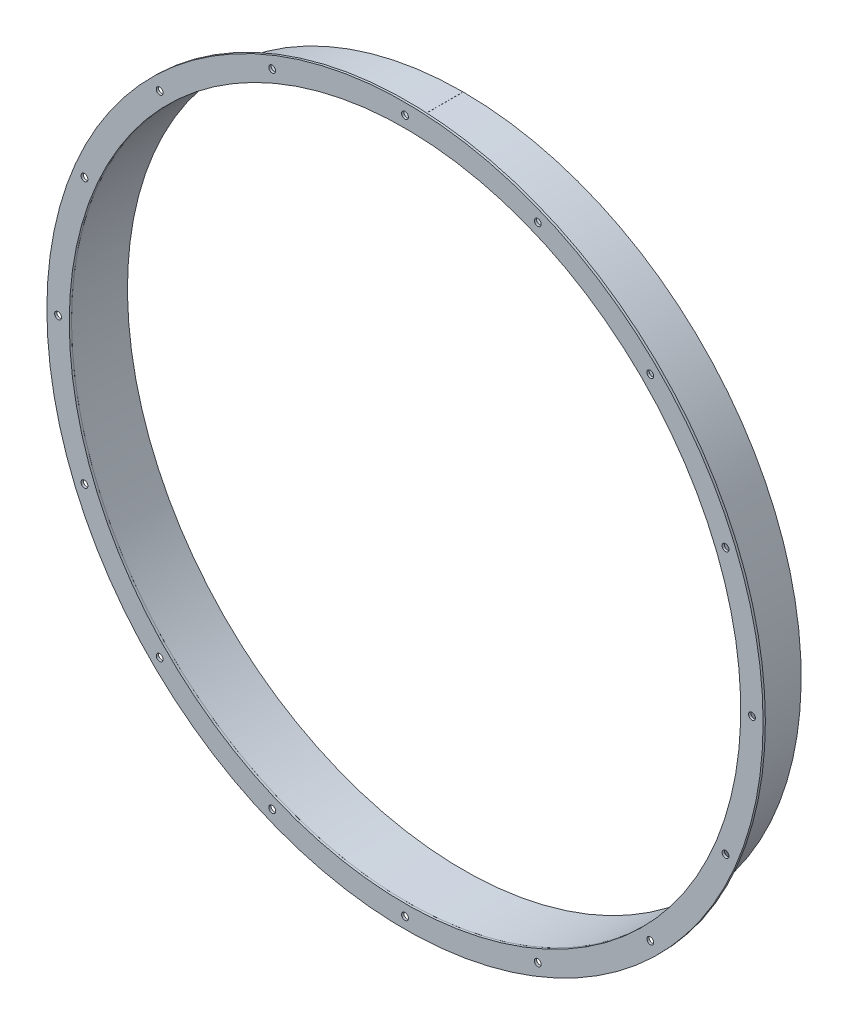
ISO-10303-21;
HEADER;
FILE_DESCRIPTION(('STEP AP214'),'2;1');
FILE_NAME('part.step','',(''),(''),'','','');
FILE_SCHEMA(('AUTOMOTIVE_DESIGN { 1 0 10303 214 1 1 1 1 }'));
ENDSEC;
DATA;
#1=APPLICATION_CONTEXT('core data for automotive mechanical design processes');
#2=APPLICATION_PROTOCOL_DEFINITION('international standard','automotive_design',2000,#1);
#3=PRODUCT_CONTEXT('',#1,'mechanical');
#4=PRODUCT('Part','Part','',(#3));
#5=PRODUCT_RELATED_PRODUCT_CATEGORY('part','',(#4));
#6=PRODUCT_DEFINITION_FORMATION('','',#4);
#7=PRODUCT_DEFINITION_CONTEXT('part definition',#1,'design');
#8=PRODUCT_DEFINITION('design','',#6,#7);
#9=PRODUCT_DEFINITION_SHAPE('','',#8);
#10=(LENGTH_UNIT() NAMED_UNIT(*) SI_UNIT(.MILLI.,.METRE.));
#11=(NAMED_UNIT(*) PLANE_ANGLE_UNIT() SI_UNIT($,.RADIAN.));
#12=(NAMED_UNIT(*) SI_UNIT($,.STERADIAN.) SOLID_ANGLE_UNIT());
#13=UNCERTAINTY_MEASURE_WITH_UNIT(LENGTH_MEASURE(1.E-05),#10,'distance_accuracy_value','');
#14=(GEOMETRIC_REPRESENTATION_CONTEXT(3) GLOBAL_UNCERTAINTY_ASSIGNED_CONTEXT((#13)) GLOBAL_UNIT_ASSIGNED_CONTEXT((#10,
#11,#12)) REPRESENTATION_CONTEXT('',''));
#15=CARTESIAN_POINT('',(0.,0.,0.));
#16=DIRECTION('',(0.,0.,1.));
#17=DIRECTION('',(1.,0.,0.));
#18=AXIS2_PLACEMENT_3D('',#15,#16,#17);
#19=CARTESIAN_POINT('',(-320.,0.,50.));
#20=DIRECTION('',(0.,0.,-1.));
#21=DIRECTION('',(-1.,0.,0.));
#22=AXIS2_PLACEMENT_3D('',#19,#20,#21);
#23=PLANE('',#22);
#24=CARTESIAN_POINT('',(0.,0.,50.));
#25=DIRECTION('',(0.,0.,-1.));
#26=DIRECTION('',(-1.,0.,0.));
#27=AXIS2_PLACEMENT_3D('',#24,#25,#26);
#28=CIRCLE('',#27,300.);
#29=CARTESIAN_POINT('',(-300.,0.,50.));
#30=VERTEX_POINT('',#29);
#31=EDGE_CURVE('E55',#30,#30,#28,.F.);
#32=ORIENTED_EDGE('',*,*,#31,.T.);
#33=EDGE_LOOP('',(#32));
#34=FACE_BOUND('',#33,.T.);
#35=CARTESIAN_POINT('',(-118.631864033174,-286.402655078501,50.));
#36=DIRECTION('',(0.,0.,-1.));
#37=DIRECTION('',(-1.,0.,0.));
#38=AXIS2_PLACEMENT_3D('',#35,#36,#37);
#39=CIRCLE('',#38,3.05000000000001);
#40=CARTESIAN_POINT('',(-121.681864033174,-286.402655078501,50.));
#41=VERTEX_POINT('',#40);
#42=EDGE_CURVE('E108',#41,#41,#39,.F.);
#43=ORIENTED_EDGE('',*,*,#42,.T.);
#44=EDGE_LOOP('',(#43));
#45=FACE_BOUND('',#44,.T.);
#46=CARTESIAN_POINT('',(-219.203102167827,-219.203102167832,50.));
#47=DIRECTION('',(0.,0.,-1.));
#48=DIRECTION('',(-1.,0.,0.));
#49=AXIS2_PLACEMENT_3D('',#46,#47,#48);
#50=CIRCLE('',#49,3.05);
#51=CARTESIAN_POINT('',(-222.253102167827,-219.203102167832,50.));
#52=VERTEX_POINT('',#51);
#53=EDGE_CURVE('E105',#52,#52,#50,.F.);
#54=ORIENTED_EDGE('',*,*,#53,.T.);
#55=EDGE_LOOP('',(#54));
#56=FACE_BOUND('',#55,.T.);
#57=CARTESIAN_POINT('',(-286.402655078498,-118.631864033181,50.));
#58=DIRECTION('',(0.,0.,-1.));
#59=DIRECTION('',(-1.,0.,0.));
#60=AXIS2_PLACEMENT_3D('',#57,#58,#59);
#61=CIRCLE('',#60,3.05);
#62=CARTESIAN_POINT('',(-289.452655078498,-118.631864033181,50.));
#63=VERTEX_POINT('',#62);
#64=EDGE_CURVE('E102',#63,#63,#61,.F.);
#65=ORIENTED_EDGE('',*,*,#64,.T.);
#66=EDGE_LOOP('',(#65));
#67=FACE_BOUND('',#66,.T.);
#68=CARTESIAN_POINT('',(-310.,-3.20911359435055E-12,50.));
#69=DIRECTION('',(0.,0.,-1.));
#70=DIRECTION('',(-1.,0.,0.));
#71=AXIS2_PLACEMENT_3D('',#68,#69,#70);
#72=CIRCLE('',#71,3.05);
#73=CARTESIAN_POINT('',(-313.05,-3.20911359435055E-12,50.));
#74=VERTEX_POINT('',#73);
#75=EDGE_CURVE('E99',#74,#74,#72,.F.);
#76=ORIENTED_EDGE('',*,*,#75,.T.);
#77=EDGE_LOOP('',(#76));
#78=FACE_BOUND('',#77,.T.);
#79=CARTESIAN_POINT('',(-286.4026550785,118.631864033175,50.));
#80=DIRECTION('',(0.,0.,-1.));
#81=DIRECTION('',(-1.,0.,0.));
#82=AXIS2_PLACEMENT_3D('',#79,#80,#81);
#83=CIRCLE('',#82,3.05);
#84=CARTESIAN_POINT('',(-289.4526550785,118.631864033175,50.));
#85=VERTEX_POINT('',#84);
#86=EDGE_CURVE('E96',#85,#85,#83,.F.);
#87=ORIENTED_EDGE('',*,*,#86,.T.);
#88=EDGE_LOOP('',(#87));
#89=FACE_BOUND('',#88,.T.);
#90=CARTESIAN_POINT('',(-219.203102167832,219.203102167828,50.));
#91=DIRECTION('',(0.,0.,-1.));
#92=DIRECTION('',(-1.,0.,0.));
#93=AXIS2_PLACEMENT_3D('',#90,#91,#92);
#94=CIRCLE('',#93,3.05);
#95=CARTESIAN_POINT('',(-222.253102167832,219.203102167828,50.));
#96=VERTEX_POINT('',#95);
#97=EDGE_CURVE('E93',#96,#96,#94,.F.);
#98=ORIENTED_EDGE('',*,*,#97,.T.);
#99=EDGE_LOOP('',(#98));
#100=FACE_BOUND('',#99,.T.);
#101=CARTESIAN_POINT('',(-118.63186403318,286.402655078498,50.));
#102=DIRECTION('',(0.,0.,-1.));
#103=DIRECTION('',(-1.,0.,0.));
#104=AXIS2_PLACEMENT_3D('',#101,#102,#103);
#105=CIRCLE('',#104,3.05000000000001);
#106=CARTESIAN_POINT('',(-121.68186403318,286.402655078498,50.));
#107=VERTEX_POINT('',#106);
#108=EDGE_CURVE('E90',#107,#107,#105,.F.);
#109=ORIENTED_EDGE('',*,*,#108,.T.);
#110=EDGE_LOOP('',(#109));
#111=FACE_BOUND('',#110,.T.);
#112=CARTESIAN_POINT('',(0.,310.,50.));
#113=DIRECTION('',(0.,0.,-1.));
#114=DIRECTION('',(-1.,0.,0.));
#115=AXIS2_PLACEMENT_3D('',#112,#113,#114);
#116=CIRCLE('',#115,3.05);
#117=CARTESIAN_POINT('',(-3.04999999999996,310.,50.));
#118=VERTEX_POINT('',#117);
#119=EDGE_CURVE('E87',#118,#118,#116,.F.);
#120=ORIENTED_EDGE('',*,*,#119,.T.);
#121=EDGE_LOOP('',(#120));
#122=FACE_BOUND('',#121,.T.);
#123=CARTESIAN_POINT('',(118.631864033176,286.4026550785,50.));
#124=DIRECTION('',(0.,0.,-1.));
#125=DIRECTION('',(-1.,0.,0.));
#126=AXIS2_PLACEMENT_3D('',#123,#124,#125);
#127=CIRCLE('',#126,3.05);
#128=CARTESIAN_POINT('',(115.581864033176,286.4026550785,50.));
#129=VERTEX_POINT('',#128);
#130=EDGE_CURVE('E84',#129,#129,#127,.F.);
#131=ORIENTED_EDGE('',*,*,#130,.T.);
#132=EDGE_LOOP('',(#131));
#133=FACE_BOUND('',#132,.T.);
#134=CARTESIAN_POINT('',(219.203102167829,219.203102167831,50.));
#135=DIRECTION('',(0.,0.,-1.));
#136=DIRECTION('',(-1.,0.,0.));
#137=AXIS2_PLACEMENT_3D('',#134,#135,#136);
#138=CIRCLE('',#137,3.05);
#139=CARTESIAN_POINT('',(216.153102167829,219.203102167831,50.));
#140=VERTEX_POINT('',#139);
#141=EDGE_CURVE('E81',#140,#140,#138,.F.);
#142=ORIENTED_EDGE('',*,*,#141,.T.);
#143=EDGE_LOOP('',(#142));
#144=FACE_BOUND('',#143,.T.);
#145=CARTESIAN_POINT('',(286.402655078498,118.631864033179,50.));
#146=DIRECTION('',(0.,0.,-1.));
#147=DIRECTION('',(-1.,0.,0.));
#148=AXIS2_PLACEMENT_3D('',#145,#146,#147);
#149=CIRCLE('',#148,3.05);
#150=CARTESIAN_POINT('',(283.352655078498,118.631864033179,50.));
#151=VERTEX_POINT('',#150);
#152=EDGE_CURVE('E78',#151,#151,#149,.F.);
#153=ORIENTED_EDGE('',*,*,#152,.T.);
#154=EDGE_LOOP('',(#153));
#155=FACE_BOUND('',#154,.T.);
#156=CARTESIAN_POINT('',(310.,1.0443951642678E-12,50.));
#157=DIRECTION('',(0.,0.,-1.));
#158=DIRECTION('',(-1.,0.,0.));
#159=AXIS2_PLACEMENT_3D('',#156,#157,#158);
#160=CIRCLE('',#159,3.05);
#161=CARTESIAN_POINT('',(306.95,1.0443951642678E-12,50.));
#162=VERTEX_POINT('',#161);
#163=EDGE_CURVE('E75',#162,#162,#160,.F.);
#164=ORIENTED_EDGE('',*,*,#163,.T.);
#165=EDGE_LOOP('',(#164));
#166=FACE_BOUND('',#165,.T.);
#167=CARTESIAN_POINT('',(286.402655078499,-118.631864033177,50.));
#168=DIRECTION('',(0.,0.,-1.));
#169=DIRECTION('',(-1.,0.,0.));
#170=AXIS2_PLACEMENT_3D('',#167,#168,#169);
#171=CIRCLE('',#170,3.05);
#172=CARTESIAN_POINT('',(283.352655078499,-118.631864033177,50.));
#173=VERTEX_POINT('',#172);
#174=EDGE_CURVE('E72',#173,#173,#171,.F.);
#175=ORIENTED_EDGE('',*,*,#174,.T.);
#176=EDGE_LOOP('',(#175));
#177=FACE_BOUND('',#176,.T.);
#178=CARTESIAN_POINT('',(219.20310216783,-219.203102167829,50.));
#179=DIRECTION('',(0.,0.,-1.));
#180=DIRECTION('',(-1.,0.,0.));
#181=AXIS2_PLACEMENT_3D('',#178,#179,#180);
#182=CIRCLE('',#181,3.05);
#183=CARTESIAN_POINT('',(216.15310216783,-219.203102167829,50.));
#184=VERTEX_POINT('',#183);
#185=EDGE_CURVE('E69',#184,#184,#182,.F.);
#186=ORIENTED_EDGE('',*,*,#185,.T.);
#187=EDGE_LOOP('',(#186));
#188=FACE_BOUND('',#187,.T.);
#189=CARTESIAN_POINT('',(118.631864033178,-286.402655078499,50.));
#190=DIRECTION('',(0.,0.,-1.));
#191=DIRECTION('',(-1.,0.,0.));
#192=AXIS2_PLACEMENT_3D('',#189,#190,#191);
#193=CIRCLE('',#192,3.04999999999998);
#194=CARTESIAN_POINT('',(115.581864033178,-286.402655078499,50.));
#195=VERTEX_POINT('',#194);
#196=EDGE_CURVE('E64',#195,#195,#193,.F.);
#197=ORIENTED_EDGE('',*,*,#196,.T.);
#198=EDGE_LOOP('',(#197));
#199=FACE_BOUND('',#198,.T.);
#200=CARTESIAN_POINT('',(0.,-310.,50.));
#201=DIRECTION('',(0.,0.,-1.));
#202=DIRECTION('',(-1.,0.,0.));
#203=AXIS2_PLACEMENT_3D('',#200,#201,#202);
#204=CIRCLE('',#203,3.05);
#205=CARTESIAN_POINT('',(-3.05000000000004,-310.,50.));
#206=VERTEX_POINT('',#205);
#207=EDGE_CURVE('E59',#206,#206,#204,.F.);
#208=ORIENTED_EDGE('',*,*,#207,.T.);
#209=EDGE_LOOP('',(#208));
#210=FACE_BOUND('',#209,.T.);
#211=CARTESIAN_POINT('',(0.,0.,50.));
#212=DIRECTION('',(0.,0.,-1.));
#213=DIRECTION('',(-1.,0.,0.));
#214=AXIS2_PLACEMENT_3D('',#211,#212,#213);
#215=CIRCLE('',#214,320.);
#216=CARTESIAN_POINT('',(-320.,0.,50.));
#217=VERTEX_POINT('',#216);
#218=EDGE_CURVE('E11',#217,#217,#215,.F.);
#219=ORIENTED_EDGE('',*,*,#218,.F.);
#220=EDGE_LOOP('',(#219));
#221=FACE_BOUND('',#220,.T.);
#222=ADVANCED_FACE('F51',(#34,#45,#56,#67,#78,#89,#100,#111,#122,#133,#144,#155,#166,#177,#188,
#199,#210,#221),#23,.T.);
#223=CARTESIAN_POINT('',(0.,0.,52.));
#224=DIRECTION('',(0.,0.,1.));
#225=DIRECTION('',(1.,0.,0.));
#226=AXIS2_PLACEMENT_3D('',#223,#224,#225);
#227=PLANE('',#226);
#228=CARTESIAN_POINT('',(-118.631864033174,-286.402655078501,52.));
#229=DIRECTION('',(0.,0.,-1.));
#230=DIRECTION('',(-1.,0.,0.));
#231=AXIS2_PLACEMENT_3D('',#228,#229,#230);
#232=CIRCLE('',#231,3.05000000000001);
#233=CARTESIAN_POINT('',(-121.681864033174,-286.402655078501,52.));
#234=VERTEX_POINT('',#233);
#235=EDGE_CURVE('E159',#234,#234,#232,.T.);
#236=ORIENTED_EDGE('',*,*,#235,.T.);
#237=EDGE_LOOP('',(#236));
#238=FACE_BOUND('',#237,.T.);
#239=CARTESIAN_POINT('',(-219.203102167827,-219.203102167832,52.));
#240=DIRECTION('',(0.,0.,-1.));
#241=DIRECTION('',(-1.,0.,0.));
#242=AXIS2_PLACEMENT_3D('',#239,#240,#241);
#243=CIRCLE('',#242,3.05);
#244=CARTESIAN_POINT('',(-222.253102167827,-219.203102167832,52.));
#245=VERTEX_POINT('',#244);
#246=EDGE_CURVE('E156',#245,#245,#243,.T.);
#247=ORIENTED_EDGE('',*,*,#246,.T.);
#248=EDGE_LOOP('',(#247));
#249=FACE_BOUND('',#248,.T.);
#250=CARTESIAN_POINT('',(-286.402655078498,-118.631864033181,52.));
#251=DIRECTION('',(0.,0.,-1.));
#252=DIRECTION('',(-1.,0.,0.));
#253=AXIS2_PLACEMENT_3D('',#250,#251,#252);
#254=CIRCLE('',#253,3.05);
#255=CARTESIAN_POINT('',(-289.452655078498,-118.631864033181,52.));
#256=VERTEX_POINT('',#255);
#257=EDGE_CURVE('E153',#256,#256,#254,.T.);
#258=ORIENTED_EDGE('',*,*,#257,.T.);
#259=EDGE_LOOP('',(#258));
#260=FACE_BOUND('',#259,.T.);
#261=CARTESIAN_POINT('',(-310.,-3.20911359435055E-12,52.));
#262=DIRECTION('',(0.,0.,-1.));
#263=DIRECTION('',(-1.,0.,0.));
#264=AXIS2_PLACEMENT_3D('',#261,#262,#263);
#265=CIRCLE('',#264,3.05);
#266=CARTESIAN_POINT('',(-313.05,-3.20911359435055E-12,52.));
#267=VERTEX_POINT('',#266);
#268=EDGE_CURVE('E150',#267,#267,#265,.T.);
#269=ORIENTED_EDGE('',*,*,#268,.T.);
#270=EDGE_LOOP('',(#269));
#271=FACE_BOUND('',#270,.T.);
#272=CARTESIAN_POINT('',(-286.4026550785,118.631864033175,52.));
#273=DIRECTION('',(0.,0.,-1.));
#274=DIRECTION('',(-1.,0.,0.));
#275=AXIS2_PLACEMENT_3D('',#272,#273,#274);
#276=CIRCLE('',#275,3.05);
#277=CARTESIAN_POINT('',(-289.4526550785,118.631864033175,52.));
#278=VERTEX_POINT('',#277);
#279=EDGE_CURVE('E147',#278,#278,#276,.T.);
#280=ORIENTED_EDGE('',*,*,#279,.T.);
#281=EDGE_LOOP('',(#280));
#282=FACE_BOUND('',#281,.T.);
#283=CARTESIAN_POINT('',(-219.203102167832,219.203102167828,52.));
#284=DIRECTION('',(0.,0.,-1.));
#285=DIRECTION('',(-1.,0.,0.));
#286=AXIS2_PLACEMENT_3D('',#283,#284,#285);
#287=CIRCLE('',#286,3.05);
#288=CARTESIAN_POINT('',(-222.253102167832,219.203102167828,52.));
#289=VERTEX_POINT('',#288);
#290=EDGE_CURVE('E144',#289,#289,#287,.T.);
#291=ORIENTED_EDGE('',*,*,#290,.T.);
#292=EDGE_LOOP('',(#291));
#293=FACE_BOUND('',#292,.T.);
#294=CARTESIAN_POINT('',(-118.63186403318,286.402655078498,52.));
#295=DIRECTION('',(0.,0.,-1.));
#296=DIRECTION('',(-1.,0.,0.));
#297=AXIS2_PLACEMENT_3D('',#294,#295,#296);
#298=CIRCLE('',#297,3.05000000000001);
#299=CARTESIAN_POINT('',(-121.68186403318,286.402655078498,52.));
#300=VERTEX_POINT('',#299);
#301=EDGE_CURVE('E141',#300,#300,#298,.T.);
#302=ORIENTED_EDGE('',*,*,#301,.T.);
#303=EDGE_LOOP('',(#302));
#304=FACE_BOUND('',#303,.T.);
#305=CARTESIAN_POINT('',(0.,310.,52.));
#306=DIRECTION('',(0.,0.,-1.));
#307=DIRECTION('',(-1.,0.,0.));
#308=AXIS2_PLACEMENT_3D('',#305,#306,#307);
#309=CIRCLE('',#308,3.05);
#310=CARTESIAN_POINT('',(-3.04999999999996,310.,52.));
#311=VERTEX_POINT('',#310);
#312=EDGE_CURVE('E138',#311,#311,#309,.T.);
#313=ORIENTED_EDGE('',*,*,#312,.T.);
#314=EDGE_LOOP('',(#313));
#315=FACE_BOUND('',#314,.T.);
#316=CARTESIAN_POINT('',(118.631864033176,286.4026550785,52.));
#317=DIRECTION('',(0.,0.,-1.));
#318=DIRECTION('',(-1.,0.,0.));
#319=AXIS2_PLACEMENT_3D('',#316,#317,#318);
#320=CIRCLE('',#319,3.05);
#321=CARTESIAN_POINT('',(115.581864033176,286.4026550785,52.));
#322=VERTEX_POINT('',#321);
#323=EDGE_CURVE('E135',#322,#322,#320,.T.);
#324=ORIENTED_EDGE('',*,*,#323,.T.);
#325=EDGE_LOOP('',(#324));
#326=FACE_BOUND('',#325,.T.);
#327=CARTESIAN_POINT('',(219.203102167829,219.203102167831,52.));
#328=DIRECTION('',(0.,0.,-1.));
#329=DIRECTION('',(-1.,0.,0.));
#330=AXIS2_PLACEMENT_3D('',#327,#328,#329);
#331=CIRCLE('',#330,3.05);
#332=CARTESIAN_POINT('',(216.153102167829,219.203102167831,52.));
#333=VERTEX_POINT('',#332);
#334=EDGE_CURVE('E132',#333,#333,#331,.T.);
#335=ORIENTED_EDGE('',*,*,#334,.T.);
#336=EDGE_LOOP('',(#335));
#337=FACE_BOUND('',#336,.T.);
#338=CARTESIAN_POINT('',(286.402655078498,118.631864033179,52.));
#339=DIRECTION('',(0.,0.,-1.));
#340=DIRECTION('',(-1.,0.,0.));
#341=AXIS2_PLACEMENT_3D('',#338,#339,#340);
#342=CIRCLE('',#341,3.05);
#343=CARTESIAN_POINT('',(283.352655078498,118.631864033179,52.));
#344=VERTEX_POINT('',#343);
#345=EDGE_CURVE('E129',#344,#344,#342,.T.);
#346=ORIENTED_EDGE('',*,*,#345,.T.);
#347=EDGE_LOOP('',(#346));
#348=FACE_BOUND('',#347,.T.);
#349=CARTESIAN_POINT('',(310.,1.0443951642678E-12,52.));
#350=DIRECTION('',(0.,0.,-1.));
#351=DIRECTION('',(-1.,0.,0.));
#352=AXIS2_PLACEMENT_3D('',#349,#350,#351);
#353=CIRCLE('',#352,3.05);
#354=CARTESIAN_POINT('',(306.95,1.0443951642678E-12,52.));
#355=VERTEX_POINT('',#354);
#356=EDGE_CURVE('E126',#355,#355,#353,.T.);
#357=ORIENTED_EDGE('',*,*,#356,.T.);
#358=EDGE_LOOP('',(#357));
#359=FACE_BOUND('',#358,.T.);
#360=CARTESIAN_POINT('',(286.402655078499,-118.631864033177,52.));
#361=DIRECTION('',(0.,0.,-1.));
#362=DIRECTION('',(-1.,0.,0.));
#363=AXIS2_PLACEMENT_3D('',#360,#361,#362);
#364=CIRCLE('',#363,3.05);
#365=CARTESIAN_POINT('',(283.352655078499,-118.631864033177,52.));
#366=VERTEX_POINT('',#365);
#367=EDGE_CURVE('E123',#366,#366,#364,.T.);
#368=ORIENTED_EDGE('',*,*,#367,.T.);
#369=EDGE_LOOP('',(#368));
#370=FACE_BOUND('',#369,.T.);
#371=CARTESIAN_POINT('',(219.20310216783,-219.203102167829,52.));
#372=DIRECTION('',(0.,0.,-1.));
#373=DIRECTION('',(-1.,0.,0.));
#374=AXIS2_PLACEMENT_3D('',#371,#372,#373);
#375=CIRCLE('',#374,3.05);
#376=CARTESIAN_POINT('',(216.15310216783,-219.203102167829,52.));
#377=VERTEX_POINT('',#376);
#378=EDGE_CURVE('E120',#377,#377,#375,.T.);
#379=ORIENTED_EDGE('',*,*,#378,.T.);
#380=EDGE_LOOP('',(#379));
#381=FACE_BOUND('',#380,.T.);
#382=CARTESIAN_POINT('',(118.631864033178,-286.402655078499,52.));
#383=DIRECTION('',(0.,0.,-1.));
#384=DIRECTION('',(-1.,0.,0.));
#385=AXIS2_PLACEMENT_3D('',#382,#383,#384);
#386=CIRCLE('',#385,3.04999999999998);
#387=CARTESIAN_POINT('',(115.581864033178,-286.402655078499,52.));
#388=VERTEX_POINT('',#387);
#389=EDGE_CURVE('E117',#388,#388,#386,.T.);
#390=ORIENTED_EDGE('',*,*,#389,.T.);
#391=EDGE_LOOP('',(#390));
#392=FACE_BOUND('',#391,.T.);
#393=CARTESIAN_POINT('',(0.,-310.,52.));
#394=DIRECTION('',(0.,0.,-1.));
#395=DIRECTION('',(-1.,0.,0.));
#396=AXIS2_PLACEMENT_3D('',#393,#394,#395);
#397=CIRCLE('',#396,3.05);
#398=CARTESIAN_POINT('',(-3.05000000000004,-310.,52.));
#399=VERTEX_POINT('',#398);
#400=EDGE_CURVE('E114',#399,#399,#397,.T.);
#401=ORIENTED_EDGE('',*,*,#400,.T.);
#402=EDGE_LOOP('',(#401));
#403=FACE_BOUND('',#402,.T.);
#404=CARTESIAN_POINT('',(0.,0.,52.));
#405=DIRECTION('',(0.,0.,-1.));
#406=DIRECTION('',(-1.,0.,0.));
#407=AXIS2_PLACEMENT_3D('',#404,#405,#406);
#408=CIRCLE('',#407,300.);
#409=CARTESIAN_POINT('',(-300.,0.,52.));
#410=VERTEX_POINT('',#409);
#411=EDGE_CURVE('E161',#410,#410,#408,.T.);
#412=ORIENTED_EDGE('',*,*,#411,.T.);
#413=EDGE_LOOP('',(#412));
#414=FACE_BOUND('',#413,.T.);
#415=CARTESIAN_POINT('',(0.,0.,52.));
#416=DIRECTION('',(0.,0.,-1.));
#417=DIRECTION('',(-1.,0.,0.));
#418=AXIS2_PLACEMENT_3D('',#415,#416,#417);
#419=CIRCLE('',#418,320.);
#420=CARTESIAN_POINT('',(-320.,0.,52.));
#421=VERTEX_POINT('',#420);
#422=EDGE_CURVE('E111',#421,#421,#419,.F.);
#423=ORIENTED_EDGE('',*,*,#422,.T.);
#424=EDGE_LOOP('',(#423));
#425=FACE_BOUND('',#424,.T.);
#426=ADVANCED_FACE('F172',(#238,#249,#260,#271,#282,#293,#304,#315,#326,#337,#348,#359,#370,
#381,#392,#403,#414,#425),#227,.T.);
#427=CARTESIAN_POINT('',(0.,0.,50.));
#428=DIRECTION('',(0.,0.,-1.));
#429=DIRECTION('',(-1.,0.,0.));
#430=AXIS2_PLACEMENT_3D('',#427,#428,#429);
#431=CYLINDRICAL_SURFACE('',#430,300.);
#432=ORIENTED_EDGE('',*,*,#411,.F.);
#433=EDGE_LOOP('',(#432));
#434=FACE_BOUND('',#433,.T.);
#435=ORIENTED_EDGE('',*,*,#31,.F.);
#436=EDGE_LOOP('',(#435));
#437=FACE_BOUND('',#436,.T.);
#438=ADVANCED_FACE('F53',(#434,#437),#431,.F.);
#439=CARTESIAN_POINT('',(-118.631864033174,-286.402655078501,52.));
#440=DIRECTION('',(0.,0.,-1.));
#441=DIRECTION('',(-1.,0.,0.));
#442=AXIS2_PLACEMENT_3D('',#439,#440,#441);
#443=CYLINDRICAL_SURFACE('',#442,3.05000000000001);
#444=ORIENTED_EDGE('',*,*,#42,.F.);
#445=EDGE_LOOP('',(#444));
#446=FACE_BOUND('',#445,.T.);
#447=ORIENTED_EDGE('',*,*,#235,.F.);
#448=EDGE_LOOP('',(#447));
#449=FACE_BOUND('',#448,.T.);
#450=ADVANCED_FACE('F171',(#446,#449),#443,.F.);
#451=CARTESIAN_POINT('',(-219.203102167827,-219.203102167832,52.));
#452=DIRECTION('',(0.,0.,-1.));
#453=DIRECTION('',(-1.,0.,0.));
#454=AXIS2_PLACEMENT_3D('',#451,#452,#453);
#455=CYLINDRICAL_SURFACE('',#454,3.05);
#456=ORIENTED_EDGE('',*,*,#53,.F.);
#457=EDGE_LOOP('',(#456));
#458=FACE_BOUND('',#457,.T.);
#459=ORIENTED_EDGE('',*,*,#246,.F.);
#460=EDGE_LOOP('',(#459));
#461=FACE_BOUND('',#460,.T.);
#462=ADVANCED_FACE('F178',(#458,#461),#455,.F.);
#463=CARTESIAN_POINT('',(-286.402655078498,-118.631864033181,52.));
#464=DIRECTION('',(0.,0.,-1.));
#465=DIRECTION('',(-1.,0.,0.));
#466=AXIS2_PLACEMENT_3D('',#463,#464,#465);
#467=CYLINDRICAL_SURFACE('',#466,3.05);
#468=ORIENTED_EDGE('',*,*,#64,.F.);
#469=EDGE_LOOP('',(#468));
#470=FACE_BOUND('',#469,.T.);
#471=ORIENTED_EDGE('',*,*,#257,.F.);
#472=EDGE_LOOP('',(#471));
#473=FACE_BOUND('',#472,.T.);
#474=ADVANCED_FACE('F191',(#470,#473),#467,.F.);
#475=CARTESIAN_POINT('',(-310.,-3.20911359435055E-12,52.));
#476=DIRECTION('',(0.,0.,-1.));
#477=DIRECTION('',(-1.,0.,0.));
#478=AXIS2_PLACEMENT_3D('',#475,#476,#477);
#479=CYLINDRICAL_SURFACE('',#478,3.05);
#480=ORIENTED_EDGE('',*,*,#75,.F.);
#481=EDGE_LOOP('',(#480));
#482=FACE_BOUND('',#481,.T.);
#483=ORIENTED_EDGE('',*,*,#268,.F.);
#484=EDGE_LOOP('',(#483));
#485=FACE_BOUND('',#484,.T.);
#486=ADVANCED_FACE('F195',(#482,#485),#479,.F.);
#487=CARTESIAN_POINT('',(-286.4026550785,118.631864033175,52.));
#488=DIRECTION('',(0.,0.,-1.));
#489=DIRECTION('',(-1.,0.,0.));
#490=AXIS2_PLACEMENT_3D('',#487,#488,#489);
#491=CYLINDRICAL_SURFACE('',#490,3.05);
#492=ORIENTED_EDGE('',*,*,#86,.F.);
#493=EDGE_LOOP('',(#492));
#494=FACE_BOUND('',#493,.T.);
#495=ORIENTED_EDGE('',*,*,#279,.F.);
#496=EDGE_LOOP('',(#495));
#497=FACE_BOUND('',#496,.T.);
#498=ADVANCED_FACE('F199',(#494,#497),#491,.F.);
#499=CARTESIAN_POINT('',(-219.203102167832,219.203102167828,52.));
#500=DIRECTION('',(0.,0.,-1.));
#501=DIRECTION('',(-1.,0.,0.));
#502=AXIS2_PLACEMENT_3D('',#499,#500,#501);
#503=CYLINDRICAL_SURFACE('',#502,3.05);
#504=ORIENTED_EDGE('',*,*,#97,.F.);
#505=EDGE_LOOP('',(#504));
#506=FACE_BOUND('',#505,.T.);
#507=ORIENTED_EDGE('',*,*,#290,.F.);
#508=EDGE_LOOP('',(#507));
#509=FACE_BOUND('',#508,.T.);
#510=ADVANCED_FACE('F203',(#506,#509),#503,.F.);
#511=CARTESIAN_POINT('',(-118.63186403318,286.402655078498,52.));
#512=DIRECTION('',(0.,0.,-1.));
#513=DIRECTION('',(-1.,0.,0.));
#514=AXIS2_PLACEMENT_3D('',#511,#512,#513);
#515=CYLINDRICAL_SURFACE('',#514,3.05000000000001);
#516=ORIENTED_EDGE('',*,*,#108,.F.);
#517=EDGE_LOOP('',(#516));
#518=FACE_BOUND('',#517,.T.);
#519=ORIENTED_EDGE('',*,*,#301,.F.);
#520=EDGE_LOOP('',(#519));
#521=FACE_BOUND('',#520,.T.);
#522=ADVANCED_FACE('F207',(#518,#521),#515,.F.);
#523=CARTESIAN_POINT('',(0.,310.,52.));
#524=DIRECTION('',(0.,0.,-1.));
#525=DIRECTION('',(-1.,0.,0.));
#526=AXIS2_PLACEMENT_3D('',#523,#524,#525);
#527=CYLINDRICAL_SURFACE('',#526,3.05);
#528=ORIENTED_EDGE('',*,*,#119,.F.);
#529=EDGE_LOOP('',(#528));
#530=FACE_BOUND('',#529,.T.);
#531=ORIENTED_EDGE('',*,*,#312,.F.);
#532=EDGE_LOOP('',(#531));
#533=FACE_BOUND('',#532,.T.);
#534=ADVANCED_FACE('F211',(#530,#533),#527,.F.);
#535=CARTESIAN_POINT('',(118.631864033176,286.4026550785,52.));
#536=DIRECTION('',(0.,0.,-1.));
#537=DIRECTION('',(-1.,0.,0.));
#538=AXIS2_PLACEMENT_3D('',#535,#536,#537);
#539=CYLINDRICAL_SURFACE('',#538,3.05);
#540=ORIENTED_EDGE('',*,*,#130,.F.);
#541=EDGE_LOOP('',(#540));
#542=FACE_BOUND('',#541,.T.);
#543=ORIENTED_EDGE('',*,*,#323,.F.);
#544=EDGE_LOOP('',(#543));
#545=FACE_BOUND('',#544,.T.);
#546=ADVANCED_FACE('F215',(#542,#545),#539,.F.);
#547=CARTESIAN_POINT('',(219.203102167829,219.203102167831,52.));
#548=DIRECTION('',(0.,0.,-1.));
#549=DIRECTION('',(-1.,0.,0.));
#550=AXIS2_PLACEMENT_3D('',#547,#548,#549);
#551=CYLINDRICAL_SURFACE('',#550,3.05);
#552=ORIENTED_EDGE('',*,*,#141,.F.);
#553=EDGE_LOOP('',(#552));
#554=FACE_BOUND('',#553,.T.);
#555=ORIENTED_EDGE('',*,*,#334,.F.);
#556=EDGE_LOOP('',(#555));
#557=FACE_BOUND('',#556,.T.);
#558=ADVANCED_FACE('F219',(#554,#557),#551,.F.);
#559=CARTESIAN_POINT('',(286.402655078498,118.631864033179,52.));
#560=DIRECTION('',(0.,0.,-1.));
#561=DIRECTION('',(-1.,0.,0.));
#562=AXIS2_PLACEMENT_3D('',#559,#560,#561);
#563=CYLINDRICAL_SURFACE('',#562,3.05);
#564=ORIENTED_EDGE('',*,*,#152,.F.);
#565=EDGE_LOOP('',(#564));
#566=FACE_BOUND('',#565,.T.);
#567=ORIENTED_EDGE('',*,*,#345,.F.);
#568=EDGE_LOOP('',(#567));
#569=FACE_BOUND('',#568,.T.);
#570=ADVANCED_FACE('F223',(#566,#569),#563,.F.);
#571=CARTESIAN_POINT('',(310.,1.0443951642678E-12,52.));
#572=DIRECTION('',(0.,0.,-1.));
#573=DIRECTION('',(-1.,0.,0.));
#574=AXIS2_PLACEMENT_3D('',#571,#572,#573);
#575=CYLINDRICAL_SURFACE('',#574,3.05);
#576=ORIENTED_EDGE('',*,*,#163,.F.);
#577=EDGE_LOOP('',(#576));
#578=FACE_BOUND('',#577,.T.);
#579=ORIENTED_EDGE('',*,*,#356,.F.);
#580=EDGE_LOOP('',(#579));
#581=FACE_BOUND('',#580,.T.);
#582=ADVANCED_FACE('F227',(#578,#581),#575,.F.);
#583=CARTESIAN_POINT('',(286.402655078499,-118.631864033177,52.));
#584=DIRECTION('',(0.,0.,-1.));
#585=DIRECTION('',(-1.,0.,0.));
#586=AXIS2_PLACEMENT_3D('',#583,#584,#585);
#587=CYLINDRICAL_SURFACE('',#586,3.05);
#588=ORIENTED_EDGE('',*,*,#174,.F.);
#589=EDGE_LOOP('',(#588));
#590=FACE_BOUND('',#589,.T.);
#591=ORIENTED_EDGE('',*,*,#367,.F.);
#592=EDGE_LOOP('',(#591));
#593=FACE_BOUND('',#592,.T.);
#594=ADVANCED_FACE('F231',(#590,#593),#587,.F.);
#595=CARTESIAN_POINT('',(219.20310216783,-219.203102167829,52.));
#596=DIRECTION('',(0.,0.,-1.));
#597=DIRECTION('',(-1.,0.,0.));
#598=AXIS2_PLACEMENT_3D('',#595,#596,#597);
#599=CYLINDRICAL_SURFACE('',#598,3.05);
#600=ORIENTED_EDGE('',*,*,#185,.F.);
#601=EDGE_LOOP('',(#600));
#602=FACE_BOUND('',#601,.T.);
#603=ORIENTED_EDGE('',*,*,#378,.F.);
#604=EDGE_LOOP('',(#603));
#605=FACE_BOUND('',#604,.T.);
#606=ADVANCED_FACE('F235',(#602,#605),#599,.F.);
#607=CARTESIAN_POINT('',(118.631864033178,-286.402655078499,52.));
#608=DIRECTION('',(0.,0.,-1.));
#609=DIRECTION('',(-1.,0.,0.));
#610=AXIS2_PLACEMENT_3D('',#607,#608,#609);
#611=CYLINDRICAL_SURFACE('',#610,3.04999999999998);
#612=ORIENTED_EDGE('',*,*,#196,.F.);
#613=EDGE_LOOP('',(#612));
#614=FACE_BOUND('',#613,.T.);
#615=ORIENTED_EDGE('',*,*,#389,.F.);
#616=EDGE_LOOP('',(#615));
#617=FACE_BOUND('',#616,.T.);
#618=ADVANCED_FACE('F239',(#614,#617),#611,.F.);
#619=CARTESIAN_POINT('',(0.,-310.,52.));
#620=DIRECTION('',(0.,0.,-1.));
#621=DIRECTION('',(-1.,0.,0.));
#622=AXIS2_PLACEMENT_3D('',#619,#620,#621);
#623=CYLINDRICAL_SURFACE('',#622,3.05);
#624=ORIENTED_EDGE('',*,*,#207,.F.);
#625=EDGE_LOOP('',(#624));
#626=FACE_BOUND('',#625,.T.);
#627=ORIENTED_EDGE('',*,*,#400,.F.);
#628=EDGE_LOOP('',(#627));
#629=FACE_BOUND('',#628,.T.);
#630=ADVANCED_FACE('F243',(#626,#629),#623,.F.);
#631=CARTESIAN_POINT('',(0.,0.,52.));
#632=DIRECTION('',(0.,0.,-1.));
#633=DIRECTION('',(-1.,0.,0.));
#634=AXIS2_PLACEMENT_3D('',#631,#632,#633);
#635=CYLINDRICAL_SURFACE('',#634,320.);
#636=ORIENTED_EDGE('',*,*,#218,.T.);
#637=EDGE_LOOP('',(#636));
#638=FACE_BOUND('',#637,.T.);
#639=ORIENTED_EDGE('',*,*,#422,.F.);
#640=EDGE_LOOP('',(#639));
#641=FACE_BOUND('',#640,.T.);
#642=ADVANCED_FACE('F186',(#638,#641),#635,.T.);
#643=CLOSED_SHELL('',(#222,#426,#438,#450,#462,#474,#486,#498,#510,#522,#534,#546,#558,#570,
#582,#594,#606,#618,#630,#642));
#644=MANIFOLD_SOLID_BREP('B2',#643);
#645=CARTESIAN_POINT('',(-320.,0.,50.));
#646=DIRECTION('',(0.,0.,-1.));
#647=DIRECTION('',(-1.,0.,0.));
#648=AXIS2_PLACEMENT_3D('',#645,#646,#647);
#649=PLANE('',#648);
#650=CARTESIAN_POINT('',(0.,0.,50.));
#651=DIRECTION('',(0.,0.,-1.));
#652=DIRECTION('',(-1.,0.,0.));
#653=AXIS2_PLACEMENT_3D('',#650,#651,#652);
#654=CIRCLE('',#653,300.);
#655=CARTESIAN_POINT('',(-0.099999999999989,299.999983333333,50.));
#656=VERTEX_POINT('',#655);
#657=CARTESIAN_POINT('',(0.,300.,50.));
#658=VERTEX_POINT('',#657);
#659=EDGE_CURVE('E500',#656,#658,#654,.F.);
#660=ORIENTED_EDGE('',*,*,#659,.F.);
#661=DIRECTION('',(0.,1.,0.));
#662=VECTOR('',#661,1.);
#663=CARTESIAN_POINT('',(-0.099999999999989,0.,50.));
#664=LINE('',#663,#662);
#665=CARTESIAN_POINT('',(-0.1,301.999983443708,50.));
#666=VERTEX_POINT('',#665);
#667=EDGE_CURVE('E530',#656,#666,#664,.T.);
#668=ORIENTED_EDGE('',*,*,#667,.T.);
#669=CARTESIAN_POINT('',(0.,0.,50.));
#670=DIRECTION('',(0.,0.,-1.));
#671=DIRECTION('',(-1.,0.,0.));
#672=AXIS2_PLACEMENT_3D('',#669,#670,#671);
#673=CIRCLE('',#672,302.);
#674=CARTESIAN_POINT('',(0.,302.,50.));
#675=VERTEX_POINT('',#674);
#676=EDGE_CURVE('E512',#675,#666,#673,.T.);
#677=ORIENTED_EDGE('',*,*,#676,.F.);
#678=DIRECTION('',(0.,1.,0.));
#679=VECTOR('',#678,1.);
#680=CARTESIAN_POINT('',(0.,0.,50.));
#681=LINE('',#680,#679);
#682=EDGE_CURVE('E476',#658,#675,#681,.T.);
#683=ORIENTED_EDGE('',*,*,#682,.F.);
#684=EDGE_LOOP('',(#660,#668,#677,#683));
#685=FACE_BOUND('',#684,.T.);
#686=ADVANCED_FACE('F454',(#685),#649,.F.);
#687=CARTESIAN_POINT('',(0.,0.,0.));
#688=DIRECTION('',(0.,0.,1.));
#689=DIRECTION('',(1.,0.,0.));
#690=AXIS2_PLACEMENT_3D('',#687,#688,#689);
#691=PLANE('',#690);
#692=CARTESIAN_POINT('',(0.,0.,0.));
#693=DIRECTION('',(0.,0.,-1.));
#694=DIRECTION('',(-1.,0.,0.));
#695=AXIS2_PLACEMENT_3D('',#692,#693,#694);
#696=CIRCLE('',#695,302.);
#697=CARTESIAN_POINT('',(-0.1,301.999983443708,0.));
#698=VERTEX_POINT('',#697);
#699=CARTESIAN_POINT('',(0.,302.,0.));
#700=VERTEX_POINT('',#699);
#701=EDGE_CURVE('E505',#698,#700,#696,.F.);
#702=ORIENTED_EDGE('',*,*,#701,.F.);
#703=DIRECTION('',(0.,-1.,0.));
#704=VECTOR('',#703,1.);
#705=CARTESIAN_POINT('',(-0.1,0.,0.));
#706=LINE('',#705,#704);
#707=CARTESIAN_POINT('',(-0.1,299.999983333333,0.));
#708=VERTEX_POINT('',#707);
#709=EDGE_CURVE('E468',#698,#708,#706,.T.);
#710=ORIENTED_EDGE('',*,*,#709,.T.);
#711=CARTESIAN_POINT('',(0.,0.,0.));
#712=DIRECTION('',(0.,0.,-1.));
#713=DIRECTION('',(-1.,0.,0.));
#714=AXIS2_PLACEMENT_3D('',#711,#712,#713);
#715=CIRCLE('',#714,300.);
#716=CARTESIAN_POINT('',(0.,300.,0.));
#717=VERTEX_POINT('',#716);
#718=EDGE_CURVE('E507',#708,#717,#715,.F.);
#719=ORIENTED_EDGE('',*,*,#718,.T.);
#720=DIRECTION('',(0.,-1.,0.));
#721=VECTOR('',#720,1.);
#722=CARTESIAN_POINT('',(0.,0.,0.));
#723=LINE('',#722,#721);
#724=EDGE_CURVE('E493',#700,#717,#723,.T.);
#725=ORIENTED_EDGE('',*,*,#724,.F.);
#726=EDGE_LOOP('',(#702,#710,#719,#725));
#727=FACE_BOUND('',#726,.T.);
#728=ADVANCED_FACE('F504',(#727),#691,.F.);
#729=CARTESIAN_POINT('',(0.,0.,50.));
#730=DIRECTION('',(0.,0.,-1.));
#731=DIRECTION('',(-1.,0.,0.));
#732=AXIS2_PLACEMENT_3D('',#729,#730,#731);
#733=CYLINDRICAL_SURFACE('',#732,300.);
#734=ORIENTED_EDGE('',*,*,#718,.F.);
#735=DIRECTION('',(0.,0.,-1.));
#736=VECTOR('',#735,1.);
#737=CARTESIAN_POINT('',(-0.1,299.999983333333,50.));
#738=LINE('',#737,#736);
#739=EDGE_CURVE('E517',#708,#656,#738,.F.);
#740=ORIENTED_EDGE('',*,*,#739,.T.);
#741=ORIENTED_EDGE('',*,*,#659,.T.);
#742=DIRECTION('',(0.,0.,-1.));
#743=VECTOR('',#742,1.);
#744=CARTESIAN_POINT('',(0.,300.,50.));
#745=LINE('',#744,#743);
#746=EDGE_CURVE('E527',#717,#658,#745,.F.);
#747=ORIENTED_EDGE('',*,*,#746,.F.);
#748=EDGE_LOOP('',(#734,#740,#741,#747));
#749=FACE_BOUND('',#748,.T.);
#750=ADVANCED_FACE('F526',(#749),#733,.F.);
#751=CARTESIAN_POINT('',(0.,0.,50.));
#752=DIRECTION('',(0.,0.,-1.));
#753=DIRECTION('',(-1.,0.,0.));
#754=AXIS2_PLACEMENT_3D('',#751,#752,#753);
#755=CYLINDRICAL_SURFACE('',#754,302.);
#756=DIRECTION('',(0.,0.,-1.));
#757=VECTOR('',#756,1.);
#758=CARTESIAN_POINT('',(-0.1,301.999983443708,50.));
#759=LINE('',#758,#757);
#760=EDGE_CURVE('E49',#698,#666,#759,.F.);
#761=ORIENTED_EDGE('',*,*,#760,.F.);
#762=ORIENTED_EDGE('',*,*,#701,.T.);
#763=DIRECTION('',(0.,0.,-1.));
#764=VECTOR('',#763,1.);
#765=CARTESIAN_POINT('',(0.,302.,50.));
#766=LINE('',#765,#764);
#767=EDGE_CURVE('E462',#700,#675,#766,.F.);
#768=ORIENTED_EDGE('',*,*,#767,.T.);
#769=ORIENTED_EDGE('',*,*,#676,.T.);
#770=EDGE_LOOP('',(#761,#762,#768,#769));
#771=FACE_BOUND('',#770,.T.);
#772=ADVANCED_FACE('F510',(#771),#755,.T.);
#773=CARTESIAN_POINT('',(0.,0.,52.));
#774=DIRECTION('',(-1.,0.,0.));
#775=DIRECTION('',(0.,0.,1.));
#776=AXIS2_PLACEMENT_3D('',#773,#774,#775);
#777=PLANE('',#776);
#778=ORIENTED_EDGE('',*,*,#746,.T.);
#779=ORIENTED_EDGE('',*,*,#682,.T.);
#780=ORIENTED_EDGE('',*,*,#767,.F.);
#781=ORIENTED_EDGE('',*,*,#724,.T.);
#782=EDGE_LOOP('',(#778,#779,#780,#781));
#783=FACE_BOUND('',#782,.T.);
#784=ADVANCED_FACE('F492',(#783),#777,.T.);
#785=CARTESIAN_POINT('',(-0.1,0.,52.));
#786=DIRECTION('',(-1.,0.,0.));
#787=DIRECTION('',(0.,0.,1.));
#788=AXIS2_PLACEMENT_3D('',#785,#786,#787);
#789=PLANE('',#788);
#790=ORIENTED_EDGE('',*,*,#709,.F.);
#791=ORIENTED_EDGE('',*,*,#760,.T.);
#792=ORIENTED_EDGE('',*,*,#667,.F.);
#793=ORIENTED_EDGE('',*,*,#739,.F.);
#794=EDGE_LOOP('',(#790,#791,#792,#793));
#795=FACE_BOUND('',#794,.T.);
#796=ADVANCED_FACE('F540',(#795),#789,.F.);
#797=CLOSED_SHELL('',(#686,#728,#750,#772,#784,#796));
#798=MANIFOLD_SOLID_BREP('B6',#797);
#799=ADVANCED_BREP_SHAPE_REPRESENTATION('',(#18,#644,#798),#14);
#800=SHAPE_DEFINITION_REPRESENTATION(#9,#799);
ENDSEC;
END-ISO-10303-21;
